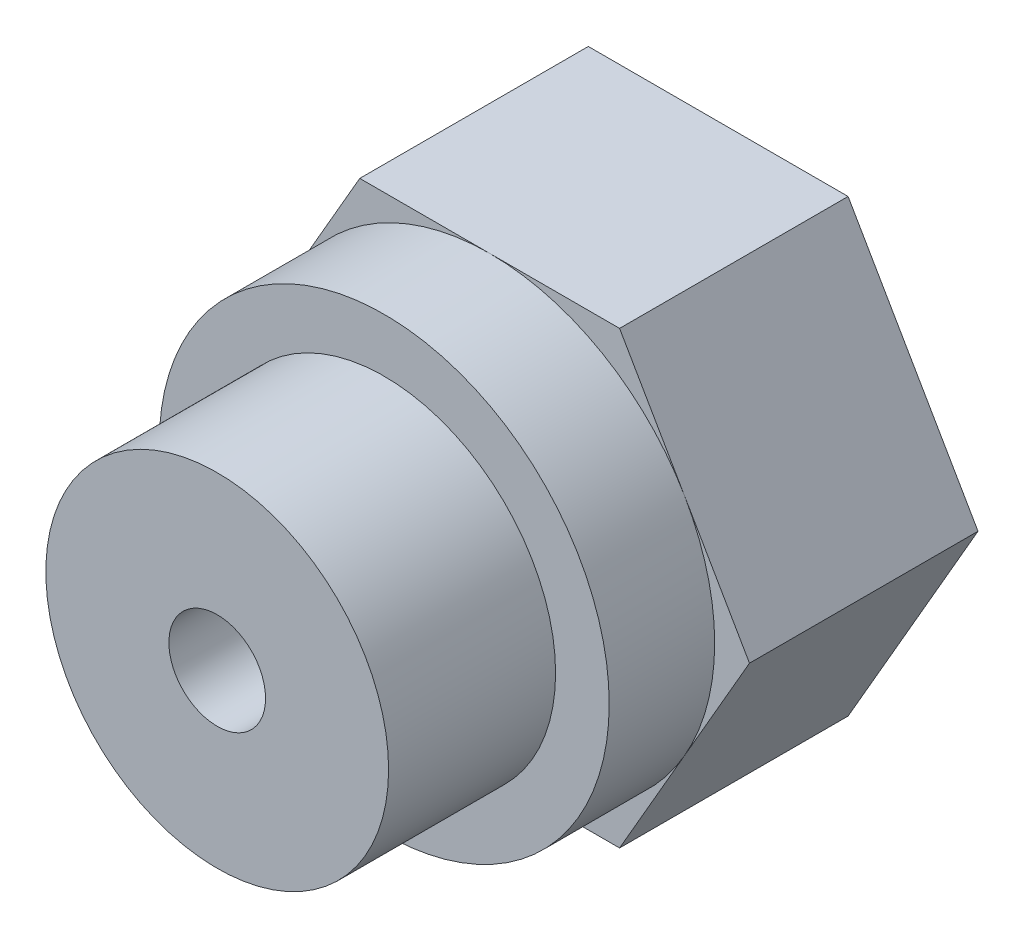
ISO-10303-21;
HEADER;
FILE_DESCRIPTION(('STEP AP214'),'2;1');
FILE_NAME('part.step','',(''),(''),'','','');
FILE_SCHEMA(('AUTOMOTIVE_DESIGN { 1 0 10303 214 1 1 1 1 }'));
ENDSEC;
DATA;
#1=APPLICATION_CONTEXT('core data for automotive mechanical design processes');
#2=APPLICATION_PROTOCOL_DEFINITION('international standard','automotive_design',2000,#1);
#3=PRODUCT_CONTEXT('',#1,'mechanical');
#4=PRODUCT('Part','Part','',(#3));
#5=PRODUCT_RELATED_PRODUCT_CATEGORY('part','',(#4));
#6=PRODUCT_DEFINITION_FORMATION('','',#4);
#7=PRODUCT_DEFINITION_CONTEXT('part definition',#1,'design');
#8=PRODUCT_DEFINITION('design','',#6,#7);
#9=PRODUCT_DEFINITION_SHAPE('','',#8);
#10=(LENGTH_UNIT() NAMED_UNIT(*) SI_UNIT(.MILLI.,.METRE.));
#11=(NAMED_UNIT(*) PLANE_ANGLE_UNIT() SI_UNIT($,.RADIAN.));
#12=(NAMED_UNIT(*) SI_UNIT($,.STERADIAN.) SOLID_ANGLE_UNIT());
#13=UNCERTAINTY_MEASURE_WITH_UNIT(LENGTH_MEASURE(1.E-05),#10,'distance_accuracy_value','');
#14=(GEOMETRIC_REPRESENTATION_CONTEXT(3) GLOBAL_UNCERTAINTY_ASSIGNED_CONTEXT((#13)) GLOBAL_UNIT_ASSIGNED_CONTEXT((#10,
#11,#12)) REPRESENTATION_CONTEXT('',''));
#15=CARTESIAN_POINT('',(0.,0.,0.));
#16=DIRECTION('',(0.,0.,1.));
#17=DIRECTION('',(1.,0.,0.));
#18=AXIS2_PLACEMENT_3D('',#15,#16,#17);
#19=CARTESIAN_POINT('',(0.,0.,6.5));
#20=DIRECTION('',(0.,0.,1.));
#21=DIRECTION('',(1.,0.,0.));
#22=AXIS2_PLACEMENT_3D('',#19,#20,#21);
#23=PLANE('',#22);
#24=CARTESIAN_POINT('',(0.,0.,6.5));
#25=DIRECTION('',(0.,0.,1.));
#26=DIRECTION('',(1.,0.,0.));
#27=AXIS2_PLACEMENT_3D('',#24,#25,#26);
#28=CIRCLE('',#27,6.40000000000001);
#29=CARTESIAN_POINT('',(5.54256258422041,3.20000000000001,6.5));
#30=VERTEX_POINT('',#29);
#31=CARTESIAN_POINT('',(0.,6.4,6.5));
#32=VERTEX_POINT('',#31);
#33=EDGE_CURVE('E135',#30,#32,#28,.T.);
#34=ORIENTED_EDGE('',*,*,#33,.F.);
#35=DIRECTION('',(-0.500000000000001,0.866025403784438,0.));
#36=VECTOR('',#35,1.);
#37=CARTESIAN_POINT('',(7.39008344562721,0.,6.5));
#38=LINE('',#37,#36);
#39=CARTESIAN_POINT('',(3.69504172281359,6.40000000000001,6.5));
#40=VERTEX_POINT('',#39);
#41=EDGE_CURVE('E123',#30,#40,#38,.T.);
#42=ORIENTED_EDGE('',*,*,#41,.T.);
#43=DIRECTION('',(-1.,0.,0.));
#44=VECTOR('',#43,1.);
#45=CARTESIAN_POINT('',(3.69504172281359,6.40000000000001,6.5));
#46=LINE('',#45,#44);
#47=EDGE_CURVE('E136',#40,#32,#46,.T.);
#48=ORIENTED_EDGE('',*,*,#47,.T.);
#49=EDGE_LOOP('',(#34,#42,#48));
#50=FACE_BOUND('',#49,.T.);
#51=ADVANCED_FACE('F38',(#50),#23,.T.);
#52=CARTESIAN_POINT('',(-5.54256258422043,3.19999999999997,6.5));
#53=VERTEX_POINT('',#52);
#54=EDGE_CURVE('E47',#32,#53,#28,.T.);
#55=ORIENTED_EDGE('',*,*,#54,.F.);
#56=CARTESIAN_POINT('',(-3.69504172281364,6.39999999999999,6.5));
#57=VERTEX_POINT('',#56);
#58=EDGE_CURVE('E122',#32,#57,#46,.T.);
#59=ORIENTED_EDGE('',*,*,#58,.T.);
#60=DIRECTION('',(-0.499999999999995,-0.866025403784442,0.));
#61=VECTOR('',#60,1.);
#62=CARTESIAN_POINT('',(-3.69504172281364,6.39999999999999,6.5));
#63=LINE('',#62,#61);
#64=EDGE_CURVE('E149',#57,#53,#63,.T.);
#65=ORIENTED_EDGE('',*,*,#64,.T.);
#66=EDGE_LOOP('',(#55,#59,#65));
#67=FACE_BOUND('',#66,.T.);
#68=ADVANCED_FACE('F208',(#67),#23,.T.);
#69=CARTESIAN_POINT('',(-5.54256258422038,-3.20000000000004,6.5));
#70=VERTEX_POINT('',#69);
#71=EDGE_CURVE('E206',#53,#70,#28,.T.);
#72=ORIENTED_EDGE('',*,*,#71,.F.);
#73=CARTESIAN_POINT('',(-7.39008344562721,0.,6.5));
#74=VERTEX_POINT('',#73);
#75=EDGE_CURVE('E148',#53,#74,#63,.T.);
#76=ORIENTED_EDGE('',*,*,#75,.T.);
#77=DIRECTION('',(0.500000000000007,-0.866025403784435,0.));
#78=VECTOR('',#77,1.);
#79=CARTESIAN_POINT('',(-7.39008344562721,0.,6.5));
#80=LINE('',#79,#78);
#81=EDGE_CURVE('E153',#74,#70,#80,.T.);
#82=ORIENTED_EDGE('',*,*,#81,.T.);
#83=EDGE_LOOP('',(#72,#76,#82));
#84=FACE_BOUND('',#83,.T.);
#85=ADVANCED_FACE('F205',(#84),#23,.T.);
#86=CARTESIAN_POINT('',(0.,-6.4,6.5));
#87=VERTEX_POINT('',#86);
#88=EDGE_CURVE('E63',#70,#87,#28,.T.);
#89=ORIENTED_EDGE('',*,*,#88,.F.);
#90=CARTESIAN_POINT('',(-3.69504172281355,-6.40000000000004,6.5));
#91=VERTEX_POINT('',#90);
#92=EDGE_CURVE('E152',#70,#91,#80,.T.);
#93=ORIENTED_EDGE('',*,*,#92,.T.);
#94=DIRECTION('',(1.,0.,0.));
#95=VECTOR('',#94,1.);
#96=CARTESIAN_POINT('',(-3.69504172281355,-6.40000000000004,6.5));
#97=LINE('',#96,#95);
#98=EDGE_CURVE('E157',#91,#87,#97,.T.);
#99=ORIENTED_EDGE('',*,*,#98,.T.);
#100=EDGE_LOOP('',(#89,#93,#99));
#101=FACE_BOUND('',#100,.T.);
#102=ADVANCED_FACE('F215',(#101),#23,.T.);
#103=CARTESIAN_POINT('',(5.54256258422045,-3.19999999999998,6.5));
#104=VERTEX_POINT('',#103);
#105=EDGE_CURVE('E55',#87,#104,#28,.T.);
#106=ORIENTED_EDGE('',*,*,#105,.F.);
#107=CARTESIAN_POINT('',(3.69504172281368,-6.39999999999996,6.5));
#108=VERTEX_POINT('',#107);
#109=EDGE_CURVE('E156',#87,#108,#97,.T.);
#110=ORIENTED_EDGE('',*,*,#109,.T.);
#111=DIRECTION('',(0.499999999999995,0.866025403784442,0.));
#112=VECTOR('',#111,1.);
#113=CARTESIAN_POINT('',(3.69504172281368,-6.39999999999996,6.5));
#114=LINE('',#113,#112);
#115=EDGE_CURVE('E133',#108,#104,#114,.T.);
#116=ORIENTED_EDGE('',*,*,#115,.T.);
#117=EDGE_LOOP('',(#106,#110,#116));
#118=FACE_BOUND('',#117,.T.);
#119=ADVANCED_FACE('F220',(#118),#23,.T.);
#120=CARTESIAN_POINT('',(3.69504172281368,-6.39999999999996,6.5));
#121=DIRECTION('',(-0.866025403784442,0.499999999999995,0.));
#122=DIRECTION('',(-0.499999999999995,-0.866025403784442,0.));
#123=AXIS2_PLACEMENT_3D('',#120,#121,#122);
#124=PLANE('',#123);
#125=DIRECTION('',(0.499999999999995,0.866025403784442,0.));
#126=VECTOR('',#125,1.);
#127=CARTESIAN_POINT('',(3.69504172281368,-6.39999999999996,0.));
#128=LINE('',#127,#126);
#129=CARTESIAN_POINT('',(3.69504172281368,-6.39999999999996,0.));
#130=VERTEX_POINT('',#129);
#131=CARTESIAN_POINT('',(7.39008344562721,0.,0.));
#132=VERTEX_POINT('',#131);
#133=EDGE_CURVE('E160',#130,#132,#128,.T.);
#134=ORIENTED_EDGE('',*,*,#133,.T.);
#135=DIRECTION('',(0.,0.,-1.));
#136=VECTOR('',#135,1.);
#137=CARTESIAN_POINT('',(7.39008344562721,0.,6.5));
#138=LINE('',#137,#136);
#139=CARTESIAN_POINT('',(7.39008344562721,0.,6.5));
#140=VERTEX_POINT('',#139);
#141=EDGE_CURVE('E42',#140,#132,#138,.T.);
#142=ORIENTED_EDGE('',*,*,#141,.F.);
#143=EDGE_CURVE('E118',#104,#140,#114,.T.);
#144=ORIENTED_EDGE('',*,*,#143,.F.);
#145=ORIENTED_EDGE('',*,*,#115,.F.);
#146=DIRECTION('',(0.,0.,-1.));
#147=VECTOR('',#146,1.);
#148=CARTESIAN_POINT('',(3.69504172281368,-6.39999999999996,6.5));
#149=LINE('',#148,#147);
#150=EDGE_CURVE('E159',#108,#130,#149,.T.);
#151=ORIENTED_EDGE('',*,*,#150,.T.);
#152=EDGE_LOOP('',(#134,#142,#144,#145,#151));
#153=FACE_BOUND('',#152,.T.);
#154=ADVANCED_FACE('F40',(#153),#124,.F.);
#155=CARTESIAN_POINT('',(7.39008344562721,0.,6.5));
#156=DIRECTION('',(-0.866025403784438,-0.500000000000001,0.));
#157=DIRECTION('',(0.500000000000001,-0.866025403784438,0.));
#158=AXIS2_PLACEMENT_3D('',#155,#156,#157);
#159=PLANE('',#158);
#160=DIRECTION('',(-0.500000000000001,0.866025403784438,0.));
#161=VECTOR('',#160,1.);
#162=CARTESIAN_POINT('',(7.39008344562721,0.,0.));
#163=LINE('',#162,#161);
#164=CARTESIAN_POINT('',(3.69504172281359,6.40000000000001,0.));
#165=VERTEX_POINT('',#164);
#166=EDGE_CURVE('E163',#132,#165,#163,.T.);
#167=ORIENTED_EDGE('',*,*,#166,.T.);
#168=DIRECTION('',(0.,0.,-1.));
#169=VECTOR('',#168,1.);
#170=CARTESIAN_POINT('',(3.69504172281359,6.40000000000001,6.5));
#171=LINE('',#170,#169);
#172=EDGE_CURVE('E129',#40,#165,#171,.T.);
#173=ORIENTED_EDGE('',*,*,#172,.F.);
#174=ORIENTED_EDGE('',*,*,#41,.F.);
#175=EDGE_CURVE('E112',#140,#30,#38,.T.);
#176=ORIENTED_EDGE('',*,*,#175,.F.);
#177=ORIENTED_EDGE('',*,*,#141,.T.);
#178=EDGE_LOOP('',(#167,#173,#174,#176,#177));
#179=FACE_BOUND('',#178,.T.);
#180=ADVANCED_FACE('F127',(#179),#159,.F.);
#181=CARTESIAN_POINT('',(3.69504172281359,6.40000000000001,6.5));
#182=DIRECTION('',(0.,-1.,0.));
#183=DIRECTION('',(1.,0.,0.));
#184=AXIS2_PLACEMENT_3D('',#181,#182,#183);
#185=PLANE('',#184);
#186=DIRECTION('',(-1.,0.,0.));
#187=VECTOR('',#186,1.);
#188=CARTESIAN_POINT('',(3.69504172281359,6.40000000000001,0.));
#189=LINE('',#188,#187);
#190=CARTESIAN_POINT('',(-3.69504172281364,6.39999999999999,0.));
#191=VERTEX_POINT('',#190);
#192=EDGE_CURVE('E165',#165,#191,#189,.T.);
#193=ORIENTED_EDGE('',*,*,#192,.T.);
#194=DIRECTION('',(0.,0.,-1.));
#195=VECTOR('',#194,1.);
#196=CARTESIAN_POINT('',(-3.69504172281364,6.39999999999999,6.5));
#197=LINE('',#196,#195);
#198=EDGE_CURVE('E181',#57,#191,#197,.T.);
#199=ORIENTED_EDGE('',*,*,#198,.F.);
#200=ORIENTED_EDGE('',*,*,#58,.F.);
#201=ORIENTED_EDGE('',*,*,#47,.F.);
#202=ORIENTED_EDGE('',*,*,#172,.T.);
#203=EDGE_LOOP('',(#193,#199,#200,#201,#202));
#204=FACE_BOUND('',#203,.T.);
#205=ADVANCED_FACE('F185',(#204),#185,.F.);
#206=CARTESIAN_POINT('',(-3.69504172281364,6.39999999999999,6.5));
#207=DIRECTION('',(0.866025403784442,-0.499999999999995,0.));
#208=DIRECTION('',(0.499999999999995,0.866025403784442,0.));
#209=AXIS2_PLACEMENT_3D('',#206,#207,#208);
#210=PLANE('',#209);
#211=DIRECTION('',(-0.499999999999995,-0.866025403784442,0.));
#212=VECTOR('',#211,1.);
#213=CARTESIAN_POINT('',(-3.69504172281364,6.39999999999999,0.));
#214=LINE('',#213,#212);
#215=CARTESIAN_POINT('',(-7.39008344562721,0.,0.));
#216=VERTEX_POINT('',#215);
#217=EDGE_CURVE('E167',#191,#216,#214,.T.);
#218=ORIENTED_EDGE('',*,*,#217,.T.);
#219=DIRECTION('',(0.,0.,-1.));
#220=VECTOR('',#219,1.);
#221=CARTESIAN_POINT('',(-7.39008344562721,0.,6.5));
#222=LINE('',#221,#220);
#223=EDGE_CURVE('E178',#74,#216,#222,.T.);
#224=ORIENTED_EDGE('',*,*,#223,.F.);
#225=ORIENTED_EDGE('',*,*,#75,.F.);
#226=ORIENTED_EDGE('',*,*,#64,.F.);
#227=ORIENTED_EDGE('',*,*,#198,.T.);
#228=EDGE_LOOP('',(#218,#224,#225,#226,#227));
#229=FACE_BOUND('',#228,.T.);
#230=ADVANCED_FACE('F196',(#229),#210,.F.);
#231=CARTESIAN_POINT('',(-7.39008344562721,0.,6.5));
#232=DIRECTION('',(0.866025403784435,0.500000000000007,0.));
#233=DIRECTION('',(-0.500000000000007,0.866025403784435,0.));
#234=AXIS2_PLACEMENT_3D('',#231,#232,#233);
#235=PLANE('',#234);
#236=DIRECTION('',(0.500000000000007,-0.866025403784435,0.));
#237=VECTOR('',#236,1.);
#238=CARTESIAN_POINT('',(-7.39008344562721,0.,0.));
#239=LINE('',#238,#237);
#240=CARTESIAN_POINT('',(-3.69504172281355,-6.40000000000004,0.));
#241=VERTEX_POINT('',#240);
#242=EDGE_CURVE('E169',#216,#241,#239,.T.);
#243=ORIENTED_EDGE('',*,*,#242,.T.);
#244=DIRECTION('',(0.,0.,-1.));
#245=VECTOR('',#244,1.);
#246=CARTESIAN_POINT('',(-3.69504172281355,-6.40000000000004,6.5));
#247=LINE('',#246,#245);
#248=EDGE_CURVE('E175',#91,#241,#247,.T.);
#249=ORIENTED_EDGE('',*,*,#248,.F.);
#250=ORIENTED_EDGE('',*,*,#92,.F.);
#251=ORIENTED_EDGE('',*,*,#81,.F.);
#252=ORIENTED_EDGE('',*,*,#223,.T.);
#253=EDGE_LOOP('',(#243,#249,#250,#251,#252));
#254=FACE_BOUND('',#253,.T.);
#255=ADVANCED_FACE('F201',(#254),#235,.F.);
#256=CARTESIAN_POINT('',(-3.69504172281355,-6.40000000000004,6.5));
#257=DIRECTION('',(0.,1.,0.));
#258=DIRECTION('',(-1.,0.,0.));
#259=AXIS2_PLACEMENT_3D('',#256,#257,#258);
#260=PLANE('',#259);
#261=DIRECTION('',(1.,0.,0.));
#262=VECTOR('',#261,1.);
#263=CARTESIAN_POINT('',(-3.69504172281355,-6.40000000000004,0.));
#264=LINE('',#263,#262);
#265=EDGE_CURVE('E171',#241,#130,#264,.T.);
#266=ORIENTED_EDGE('',*,*,#265,.T.);
#267=ORIENTED_EDGE('',*,*,#150,.F.);
#268=ORIENTED_EDGE('',*,*,#109,.F.);
#269=ORIENTED_EDGE('',*,*,#98,.F.);
#270=ORIENTED_EDGE('',*,*,#248,.T.);
#271=EDGE_LOOP('',(#266,#267,#268,#269,#270));
#272=FACE_BOUND('',#271,.T.);
#273=ADVANCED_FACE('F219',(#272),#260,.F.);
#274=EDGE_CURVE('E116',#104,#30,#28,.T.);
#275=ORIENTED_EDGE('',*,*,#274,.F.);
#276=ORIENTED_EDGE('',*,*,#143,.T.);
#277=ORIENTED_EDGE('',*,*,#175,.T.);
#278=EDGE_LOOP('',(#275,#276,#277));
#279=FACE_BOUND('',#278,.T.);
#280=ADVANCED_FACE('F114',(#279),#23,.T.);
#281=CARTESIAN_POINT('',(0.,0.,0.));
#282=DIRECTION('',(0.,0.,1.));
#283=DIRECTION('',(1.,0.,0.));
#284=AXIS2_PLACEMENT_3D('',#281,#282,#283);
#285=PLANE('',#284);
#286=CARTESIAN_POINT('',(0.,0.,0.));
#287=DIRECTION('',(0.,0.,-1.));
#288=DIRECTION('',(-1.,0.,0.));
#289=AXIS2_PLACEMENT_3D('',#286,#287,#288);
#290=CIRCLE('',#289,4.2);
#291=CARTESIAN_POINT('',(-4.2,0.,0.));
#292=VERTEX_POINT('',#291);
#293=EDGE_CURVE('E381',#292,#292,#290,.T.);
#294=ORIENTED_EDGE('',*,*,#293,.F.);
#295=EDGE_LOOP('',(#294));
#296=FACE_BOUND('',#295,.T.);
#297=ORIENTED_EDGE('',*,*,#133,.F.);
#298=ORIENTED_EDGE('',*,*,#265,.F.);
#299=ORIENTED_EDGE('',*,*,#242,.F.);
#300=ORIENTED_EDGE('',*,*,#217,.F.);
#301=ORIENTED_EDGE('',*,*,#192,.F.);
#302=ORIENTED_EDGE('',*,*,#166,.F.);
#303=EDGE_LOOP('',(#297,#298,#299,#300,#301,#302));
#304=FACE_BOUND('',#303,.T.);
#305=ADVANCED_FACE('F191',(#296,#304),#285,.F.);
#306=CARTESIAN_POINT('',(0.,0.,9.5));
#307=DIRECTION('',(0.,0.,-1.));
#308=DIRECTION('',(-1.,0.,0.));
#309=AXIS2_PLACEMENT_3D('',#306,#307,#308);
#310=CYLINDRICAL_SURFACE('',#309,6.40000000000001);
#311=CARTESIAN_POINT('',(0.,0.,9.5));
#312=DIRECTION('',(0.,0.,1.));
#313=DIRECTION('',(1.,0.,0.));
#314=AXIS2_PLACEMENT_3D('',#311,#312,#313);
#315=CIRCLE('',#314,6.40000000000001);
#316=CARTESIAN_POINT('',(6.40000000000001,0.,9.5));
#317=VERTEX_POINT('',#316);
#318=EDGE_CURVE('E139',#317,#317,#315,.T.);
#319=ORIENTED_EDGE('',*,*,#318,.F.);
#320=EDGE_LOOP('',(#319));
#321=FACE_BOUND('',#320,.T.);
#322=ORIENTED_EDGE('',*,*,#33,.T.);
#323=ORIENTED_EDGE('',*,*,#54,.T.);
#324=ORIENTED_EDGE('',*,*,#71,.T.);
#325=ORIENTED_EDGE('',*,*,#88,.T.);
#326=ORIENTED_EDGE('',*,*,#105,.T.);
#327=ORIENTED_EDGE('',*,*,#274,.T.);
#328=EDGE_LOOP('',(#322,#323,#324,#325,#326,#327));
#329=FACE_BOUND('',#328,.T.);
#330=ADVANCED_FACE('F142',(#321,#329),#310,.T.);
#331=CARTESIAN_POINT('',(0.,0.,9.5));
#332=DIRECTION('',(0.,0.,1.));
#333=DIRECTION('',(1.,0.,0.));
#334=AXIS2_PLACEMENT_3D('',#331,#332,#333);
#335=PLANE('',#334);
#336=CARTESIAN_POINT('',(0.,0.,9.5));
#337=DIRECTION('',(0.,0.,1.));
#338=DIRECTION('',(1.,0.,0.));
#339=AXIS2_PLACEMENT_3D('',#336,#337,#338);
#340=CIRCLE('',#339,4.875);
#341=CARTESIAN_POINT('',(4.875,0.,9.5));
#342=VERTEX_POINT('',#341);
#343=EDGE_CURVE('E11',#342,#342,#340,.T.);
#344=ORIENTED_EDGE('',*,*,#343,.F.);
#345=EDGE_LOOP('',(#344));
#346=FACE_BOUND('',#345,.T.);
#347=ORIENTED_EDGE('',*,*,#318,.T.);
#348=EDGE_LOOP('',(#347));
#349=FACE_BOUND('',#348,.T.);
#350=ADVANCED_FACE('F301',(#346,#349),#335,.T.);
#351=CARTESIAN_POINT('',(0.,0.,7.5));
#352=DIRECTION('',(0.,0.,-1.));
#353=DIRECTION('',(-1.,0.,0.));
#354=AXIS2_PLACEMENT_3D('',#351,#352,#353);
#355=CYLINDRICAL_SURFACE('',#354,4.2);
#356=CARTESIAN_POINT('',(0.,0.,7.5));
#357=DIRECTION('',(0.,0.,-1.));
#358=DIRECTION('',(-1.,0.,0.));
#359=AXIS2_PLACEMENT_3D('',#356,#357,#358);
#360=CIRCLE('',#359,4.2);
#361=CARTESIAN_POINT('',(-4.2,0.,7.5));
#362=VERTEX_POINT('',#361);
#363=EDGE_CURVE('E140',#362,#362,#360,.T.);
#364=ORIENTED_EDGE('',*,*,#363,.F.);
#365=EDGE_LOOP('',(#364));
#366=FACE_BOUND('',#365,.T.);
#367=ORIENTED_EDGE('',*,*,#293,.T.);
#368=EDGE_LOOP('',(#367));
#369=FACE_BOUND('',#368,.T.);
#370=ADVANCED_FACE('F314',(#366,#369),#355,.F.);
#371=CARTESIAN_POINT('',(0.,0.,7.5));
#372=DIRECTION('',(0.,0.,-1.));
#373=DIRECTION('',(-1.,0.,0.));
#374=AXIS2_PLACEMENT_3D('',#371,#372,#373);
#375=PLANE('',#374);
#376=CARTESIAN_POINT('',(0.,0.,7.5));
#377=DIRECTION('',(0.,0.,-1.));
#378=DIRECTION('',(-1.,0.,0.));
#379=AXIS2_PLACEMENT_3D('',#376,#377,#378);
#380=CIRCLE('',#379,1.375);
#381=CARTESIAN_POINT('',(-1.375,0.,7.5));
#382=VERTEX_POINT('',#381);
#383=EDGE_CURVE('E372',#382,#382,#380,.T.);
#384=ORIENTED_EDGE('',*,*,#383,.F.);
#385=EDGE_LOOP('',(#384));
#386=FACE_BOUND('',#385,.T.);
#387=ORIENTED_EDGE('',*,*,#363,.T.);
#388=EDGE_LOOP('',(#387));
#389=FACE_BOUND('',#388,.T.);
#390=ADVANCED_FACE('F319',(#386,#389),#375,.T.);
#391=CARTESIAN_POINT('',(0.,0.,14.25));
#392=DIRECTION('',(0.,0.,-1.));
#393=DIRECTION('',(-1.,0.,0.));
#394=AXIS2_PLACEMENT_3D('',#391,#392,#393);
#395=CYLINDRICAL_SURFACE('',#394,4.875);
#396=CARTESIAN_POINT('',(0.,0.,14.25));
#397=DIRECTION('',(0.,0.,1.));
#398=DIRECTION('',(1.,0.,0.));
#399=AXIS2_PLACEMENT_3D('',#396,#397,#398);
#400=CIRCLE('',#399,4.875);
#401=CARTESIAN_POINT('',(4.875,0.,14.25));
#402=VERTEX_POINT('',#401);
#403=EDGE_CURVE('E377',#402,#402,#400,.T.);
#404=ORIENTED_EDGE('',*,*,#403,.F.);
#405=EDGE_LOOP('',(#404));
#406=FACE_BOUND('',#405,.T.);
#407=ORIENTED_EDGE('',*,*,#343,.T.);
#408=EDGE_LOOP('',(#407));
#409=FACE_BOUND('',#408,.T.);
#410=ADVANCED_FACE('F333',(#406,#409),#395,.T.);
#411=CARTESIAN_POINT('',(0.,0.,14.25));
#412=DIRECTION('',(0.,0.,1.));
#413=DIRECTION('',(1.,0.,0.));
#414=AXIS2_PLACEMENT_3D('',#411,#412,#413);
#415=PLANE('',#414);
#416=CARTESIAN_POINT('',(0.,0.,14.25));
#417=DIRECTION('',(0.,0.,1.));
#418=DIRECTION('',(1.,0.,0.));
#419=AXIS2_PLACEMENT_3D('',#416,#417,#418);
#420=CIRCLE('',#419,1.375);
#421=CARTESIAN_POINT('',(1.375,0.,14.25));
#422=VERTEX_POINT('',#421);
#423=EDGE_CURVE('E375',#422,#422,#420,.T.);
#424=ORIENTED_EDGE('',*,*,#423,.F.);
#425=EDGE_LOOP('',(#424));
#426=FACE_BOUND('',#425,.T.);
#427=ORIENTED_EDGE('',*,*,#403,.T.);
#428=EDGE_LOOP('',(#427));
#429=FACE_BOUND('',#428,.T.);
#430=ADVANCED_FACE('F338',(#426,#429),#415,.T.);
#431=CARTESIAN_POINT('',(0.,0.,0.));
#432=DIRECTION('',(0.,0.,1.));
#433=DIRECTION('',(1.,0.,0.));
#434=AXIS2_PLACEMENT_3D('',#431,#432,#433);
#435=CYLINDRICAL_SURFACE('',#434,1.375);
#436=ORIENTED_EDGE('',*,*,#383,.T.);
#437=EDGE_LOOP('',(#436));
#438=FACE_BOUND('',#437,.T.);
#439=ORIENTED_EDGE('',*,*,#423,.T.);
#440=EDGE_LOOP('',(#439));
#441=FACE_BOUND('',#440,.T.);
#442=ADVANCED_FACE('F355',(#438,#441),#435,.F.);
#443=CLOSED_SHELL('',(#51,#68,#85,#102,#119,#154,#180,#205,#230,#255,#273,#280,#305,#330,#350,
#370,#390,#410,#430,#442));
#444=MANIFOLD_SOLID_BREP('B2',#443);
#445=ADVANCED_BREP_SHAPE_REPRESENTATION('',(#18,#444),#14);
#446=SHAPE_DEFINITION_REPRESENTATION(#9,#445);
ENDSEC;
END-ISO-10303-21;
